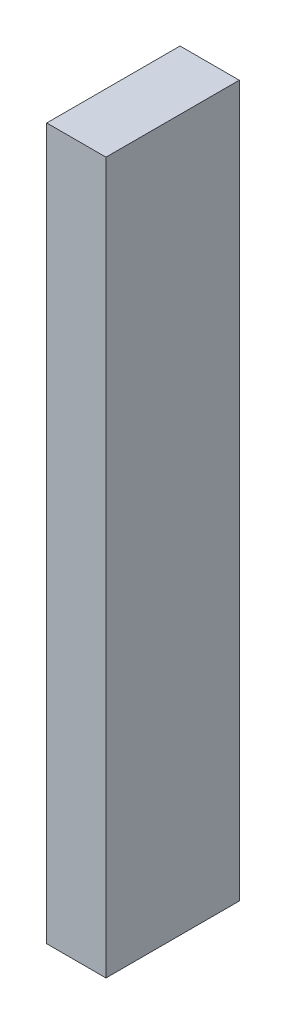
ISO-10303-21;
HEADER;
FILE_DESCRIPTION(('STEP AP214'),'2;1');
FILE_NAME('part.step','',(''),(''),'','','');
FILE_SCHEMA(('AUTOMOTIVE_DESIGN { 1 0 10303 214 1 1 1 1 }'));
ENDSEC;
DATA;
#1=APPLICATION_CONTEXT('core data for automotive mechanical design processes');
#2=APPLICATION_PROTOCOL_DEFINITION('international standard','automotive_design',2000,#1);
#3=PRODUCT_CONTEXT('',#1,'mechanical');
#4=PRODUCT('Part','Part','',(#3));
#5=PRODUCT_RELATED_PRODUCT_CATEGORY('part','',(#4));
#6=PRODUCT_DEFINITION_FORMATION('','',#4);
#7=PRODUCT_DEFINITION_CONTEXT('part definition',#1,'design');
#8=PRODUCT_DEFINITION('design','',#6,#7);
#9=PRODUCT_DEFINITION_SHAPE('','',#8);
#10=(LENGTH_UNIT() NAMED_UNIT(*) SI_UNIT(.MILLI.,.METRE.));
#11=(NAMED_UNIT(*) PLANE_ANGLE_UNIT() SI_UNIT($,.RADIAN.));
#12=(NAMED_UNIT(*) SI_UNIT($,.STERADIAN.) SOLID_ANGLE_UNIT());
#13=UNCERTAINTY_MEASURE_WITH_UNIT(LENGTH_MEASURE(1.E-05),#10,'distance_accuracy_value','');
#14=(GEOMETRIC_REPRESENTATION_CONTEXT(3) GLOBAL_UNCERTAINTY_ASSIGNED_CONTEXT((#13)) GLOBAL_UNIT_ASSIGNED_CONTEXT((#10,
#11,#12)) REPRESENTATION_CONTEXT('',''));
#15=CARTESIAN_POINT('',(0.,0.,0.));
#16=DIRECTION('',(0.,0.,1.));
#17=DIRECTION('',(1.,0.,0.));
#18=AXIS2_PLACEMENT_3D('',#15,#16,#17);
#19=CARTESIAN_POINT('',(-126.488766336441,-463.55,181.503251150662));
#20=DIRECTION('',(1.,0.,0.));
#21=DIRECTION('',(0.,0.,-1.));
#22=AXIS2_PLACEMENT_3D('',#19,#20,#21);
#23=PLANE('',#22);
#24=DIRECTION('',(0.,-1.,0.));
#25=VECTOR('',#24,1.);
#26=CARTESIAN_POINT('',(-126.488766336441,-463.55,28.575));
#27=LINE('',#26,#25);
#28=CARTESIAN_POINT('',(-126.488766336441,-311.15,28.575));
#29=VERTEX_POINT('',#28);
#30=CARTESIAN_POINT('',(-126.488766336441,-463.55,28.575));
#31=VERTEX_POINT('',#30);
#32=EDGE_CURVE('E85',#29,#31,#27,.T.);
#33=ORIENTED_EDGE('',*,*,#32,.F.);
#34=DIRECTION('',(0.,0.,-1.));
#35=VECTOR('',#34,1.);
#36=CARTESIAN_POINT('',(-126.488766336441,-311.15,181.503251150662));
#37=LINE('',#36,#35);
#38=CARTESIAN_POINT('',(-126.488766336441,-311.15,0.));
#39=VERTEX_POINT('',#38);
#40=EDGE_CURVE('E39',#29,#39,#37,.T.);
#41=ORIENTED_EDGE('',*,*,#40,.T.);
#42=DIRECTION('',(0.,-1.,0.));
#43=VECTOR('',#42,1.);
#44=CARTESIAN_POINT('',(-126.488766336441,-463.55,0.));
#45=LINE('',#44,#43);
#46=CARTESIAN_POINT('',(-126.488766336441,-463.55,0.));
#47=VERTEX_POINT('',#46);
#48=EDGE_CURVE('E83',#39,#47,#45,.T.);
#49=ORIENTED_EDGE('',*,*,#48,.T.);
#50=DIRECTION('',(0.,0.,-1.));
#51=VECTOR('',#50,1.);
#52=CARTESIAN_POINT('',(-126.488766336441,-463.55,181.503251150662));
#53=LINE('',#52,#51);
#54=EDGE_CURVE('E74',#31,#47,#53,.T.);
#55=ORIENTED_EDGE('',*,*,#54,.F.);
#56=EDGE_LOOP('',(#33,#41,#49,#55));
#57=FACE_BOUND('',#56,.T.);
#58=ADVANCED_FACE('F35',(#57),#23,.F.);
#59=CARTESIAN_POINT('',(-126.488766336441,-463.55,181.503251150662));
#60=DIRECTION('',(0.,1.,0.));
#61=DIRECTION('',(0.,0.,1.));
#62=AXIS2_PLACEMENT_3D('',#59,#60,#61);
#63=PLANE('',#62);
#64=DIRECTION('',(1.,0.,0.));
#65=VECTOR('',#64,1.);
#66=CARTESIAN_POINT('',(-126.488766336441,-463.55,28.575));
#67=LINE('',#66,#65);
#68=CARTESIAN_POINT('',(-113.788766336441,-463.55,28.575));
#69=VERTEX_POINT('',#68);
#70=EDGE_CURVE('E44',#31,#69,#67,.T.);
#71=ORIENTED_EDGE('',*,*,#70,.F.);
#72=ORIENTED_EDGE('',*,*,#54,.T.);
#73=DIRECTION('',(1.,0.,0.));
#74=VECTOR('',#73,1.);
#75=CARTESIAN_POINT('',(-126.488766336441,-463.55,0.));
#76=LINE('',#75,#74);
#77=CARTESIAN_POINT('',(-113.788766336441,-463.55,0.));
#78=VERTEX_POINT('',#77);
#79=EDGE_CURVE('E95',#47,#78,#76,.T.);
#80=ORIENTED_EDGE('',*,*,#79,.T.);
#81=DIRECTION('',(0.,0.,-1.));
#82=VECTOR('',#81,1.);
#83=CARTESIAN_POINT('',(-113.788766336441,-463.55,181.503251150662));
#84=LINE('',#83,#82);
#85=EDGE_CURVE('E104',#69,#78,#84,.T.);
#86=ORIENTED_EDGE('',*,*,#85,.F.);
#87=EDGE_LOOP('',(#71,#72,#80,#86));
#88=FACE_BOUND('',#87,.T.);
#89=ADVANCED_FACE('F108',(#88),#63,.F.);
#90=CARTESIAN_POINT('',(-113.788766336441,-463.55,181.503251150662));
#91=DIRECTION('',(-1.,0.,0.));
#92=DIRECTION('',(0.,0.,1.));
#93=AXIS2_PLACEMENT_3D('',#90,#91,#92);
#94=PLANE('',#93);
#95=DIRECTION('',(0.,1.,0.));
#96=VECTOR('',#95,1.);
#97=CARTESIAN_POINT('',(-113.788766336441,-463.55,28.575));
#98=LINE('',#97,#96);
#99=CARTESIAN_POINT('',(-113.788766336441,-311.15,28.575));
#100=VERTEX_POINT('',#99);
#101=EDGE_CURVE('E11',#69,#100,#98,.T.);
#102=ORIENTED_EDGE('',*,*,#101,.F.);
#103=ORIENTED_EDGE('',*,*,#85,.T.);
#104=DIRECTION('',(0.,1.,0.));
#105=VECTOR('',#104,1.);
#106=CARTESIAN_POINT('',(-113.788766336441,-463.55,0.));
#107=LINE('',#106,#105);
#108=CARTESIAN_POINT('',(-113.788766336441,-311.15,0.));
#109=VERTEX_POINT('',#108);
#110=EDGE_CURVE('E105',#78,#109,#107,.T.);
#111=ORIENTED_EDGE('',*,*,#110,.T.);
#112=DIRECTION('',(0.,0.,-1.));
#113=VECTOR('',#112,1.);
#114=CARTESIAN_POINT('',(-113.788766336441,-311.15,181.503251150662));
#115=LINE('',#114,#113);
#116=EDGE_CURVE('E57',#100,#109,#115,.T.);
#117=ORIENTED_EDGE('',*,*,#116,.F.);
#118=EDGE_LOOP('',(#102,#103,#111,#117));
#119=FACE_BOUND('',#118,.T.);
#120=ADVANCED_FACE('F107',(#119),#94,.F.);
#121=CARTESIAN_POINT('',(-126.488766336441,-311.15,181.503251150662));
#122=DIRECTION('',(0.,-1.,0.));
#123=DIRECTION('',(0.,0.,-1.));
#124=AXIS2_PLACEMENT_3D('',#121,#122,#123);
#125=PLANE('',#124);
#126=DIRECTION('',(-1.,0.,0.));
#127=VECTOR('',#126,1.);
#128=CARTESIAN_POINT('',(-126.488766336441,-311.15,28.575));
#129=LINE('',#128,#127);
#130=EDGE_CURVE('E92',#100,#29,#129,.T.);
#131=ORIENTED_EDGE('',*,*,#130,.F.);
#132=ORIENTED_EDGE('',*,*,#116,.T.);
#133=DIRECTION('',(-1.,0.,0.));
#134=VECTOR('',#133,1.);
#135=CARTESIAN_POINT('',(-126.488766336441,-311.15,0.));
#136=LINE('',#135,#134);
#137=EDGE_CURVE('E88',#109,#39,#136,.T.);
#138=ORIENTED_EDGE('',*,*,#137,.T.);
#139=ORIENTED_EDGE('',*,*,#40,.F.);
#140=EDGE_LOOP('',(#131,#132,#138,#139));
#141=FACE_BOUND('',#140,.T.);
#142=ADVANCED_FACE('F89',(#141),#125,.F.);
#143=CARTESIAN_POINT('',(0.,0.,0.));
#144=DIRECTION('',(0.,0.,-1.));
#145=DIRECTION('',(-1.,0.,0.));
#146=AXIS2_PLACEMENT_3D('',#143,#144,#145);
#147=PLANE('',#146);
#148=ORIENTED_EDGE('',*,*,#48,.F.);
#149=ORIENTED_EDGE('',*,*,#137,.F.);
#150=ORIENTED_EDGE('',*,*,#110,.F.);
#151=ORIENTED_EDGE('',*,*,#79,.F.);
#152=EDGE_LOOP('',(#148,#149,#150,#151));
#153=FACE_BOUND('',#152,.T.);
#154=ADVANCED_FACE('F94',(#153),#147,.T.);
#155=CARTESIAN_POINT('',(0.,0.,28.575));
#156=DIRECTION('',(0.,0.,1.));
#157=DIRECTION('',(1.,0.,0.));
#158=AXIS2_PLACEMENT_3D('',#155,#156,#157);
#159=PLANE('',#158);
#160=ORIENTED_EDGE('',*,*,#130,.T.);
#161=ORIENTED_EDGE('',*,*,#32,.T.);
#162=ORIENTED_EDGE('',*,*,#70,.T.);
#163=ORIENTED_EDGE('',*,*,#101,.T.);
#164=EDGE_LOOP('',(#160,#161,#162,#163));
#165=FACE_BOUND('',#164,.T.);
#166=ADVANCED_FACE('F37',(#165),#159,.T.);
#167=CLOSED_SHELL('',(#58,#89,#120,#142,#154,#166));
#168=MANIFOLD_SOLID_BREP('B2',#167);
#169=ADVANCED_BREP_SHAPE_REPRESENTATION('',(#18,#168),#14);
#170=SHAPE_DEFINITION_REPRESENTATION(#9,#169);
ENDSEC;
END-ISO-10303-21;
